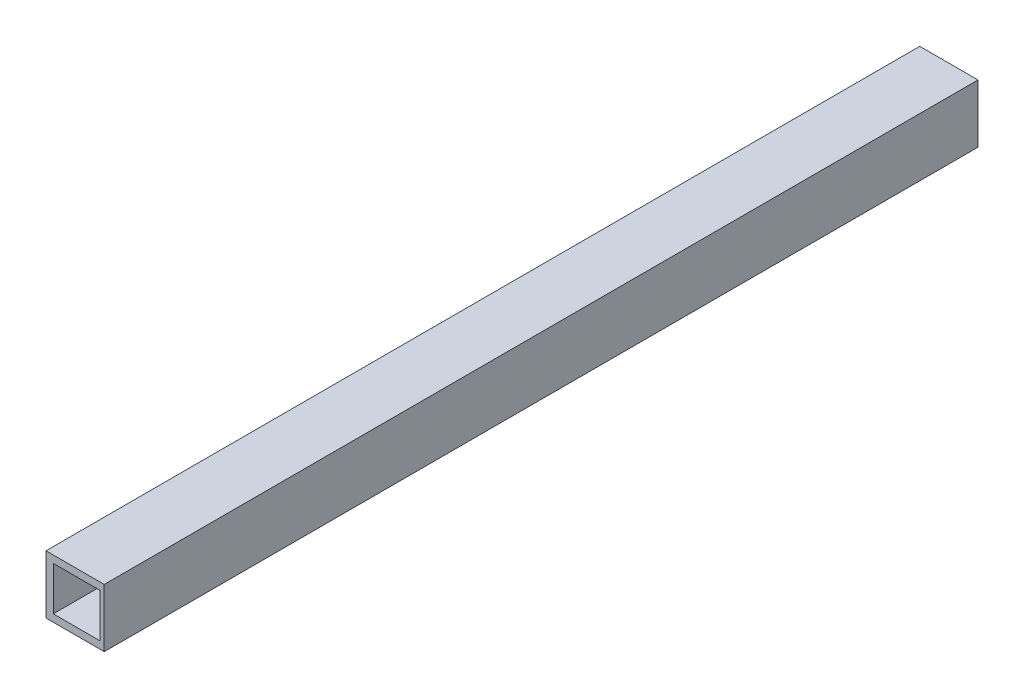
ISO-10303-21;
HEADER;
FILE_DESCRIPTION(('STEP AP214'),'2;1');
FILE_NAME('part.step','',(''),(''),'','','');
FILE_SCHEMA(('AUTOMOTIVE_DESIGN { 1 0 10303 214 1 1 1 1 }'));
ENDSEC;
DATA;
#1=APPLICATION_CONTEXT('core data for automotive mechanical design processes');
#2=APPLICATION_PROTOCOL_DEFINITION('international standard','automotive_design',2000,#1);
#3=PRODUCT_CONTEXT('',#1,'mechanical');
#4=PRODUCT('Part','Part','',(#3));
#5=PRODUCT_RELATED_PRODUCT_CATEGORY('part','',(#4));
#6=PRODUCT_DEFINITION_FORMATION('','',#4);
#7=PRODUCT_DEFINITION_CONTEXT('part definition',#1,'design');
#8=PRODUCT_DEFINITION('design','',#6,#7);
#9=PRODUCT_DEFINITION_SHAPE('','',#8);
#10=(LENGTH_UNIT() NAMED_UNIT(*) SI_UNIT(.MILLI.,.METRE.));
#11=(NAMED_UNIT(*) PLANE_ANGLE_UNIT() SI_UNIT($,.RADIAN.));
#12=(NAMED_UNIT(*) SI_UNIT($,.STERADIAN.) SOLID_ANGLE_UNIT());
#13=UNCERTAINTY_MEASURE_WITH_UNIT(LENGTH_MEASURE(1.E-05),#10,'distance_accuracy_value','');
#14=(GEOMETRIC_REPRESENTATION_CONTEXT(3) GLOBAL_UNCERTAINTY_ASSIGNED_CONTEXT((#13)) GLOBAL_UNIT_ASSIGNED_CONTEXT((#10,
#11,#12)) REPRESENTATION_CONTEXT('',''));
#15=CARTESIAN_POINT('',(0.,0.,0.));
#16=DIRECTION('',(0.,0.,1.));
#17=DIRECTION('',(1.,0.,0.));
#18=AXIS2_PLACEMENT_3D('',#15,#16,#17);
#19=CARTESIAN_POINT('',(0.,0.,381.));
#20=DIRECTION('',(-1.,0.,0.));
#21=DIRECTION('',(0.,-1.,0.));
#22=AXIS2_PLACEMENT_3D('',#19,#20,#21);
#23=PLANE('',#22);
#24=DIRECTION('',(0.,1.,0.));
#25=VECTOR('',#24,1.);
#26=CARTESIAN_POINT('',(0.,0.,0.));
#27=LINE('',#26,#25);
#28=CARTESIAN_POINT('',(0.,0.,0.));
#29=VERTEX_POINT('',#28);
#30=CARTESIAN_POINT('',(0.,25.4,0.));
#31=VERTEX_POINT('',#30);
#32=EDGE_CURVE('E148',#29,#31,#27,.T.);
#33=ORIENTED_EDGE('',*,*,#32,.F.);
#34=DIRECTION('',(0.,0.,-1.));
#35=VECTOR('',#34,1.);
#36=CARTESIAN_POINT('',(0.,0.,381.));
#37=LINE('',#36,#35);
#38=CARTESIAN_POINT('',(0.,0.,381.));
#39=VERTEX_POINT('',#38);
#40=EDGE_CURVE('E11',#39,#29,#37,.T.);
#41=ORIENTED_EDGE('',*,*,#40,.F.);
#42=DIRECTION('',(0.,1.,0.));
#43=VECTOR('',#42,1.);
#44=CARTESIAN_POINT('',(0.,0.,381.));
#45=LINE('',#44,#43);
#46=CARTESIAN_POINT('',(0.,25.4,381.));
#47=VERTEX_POINT('',#46);
#48=EDGE_CURVE('E154',#39,#47,#45,.T.);
#49=ORIENTED_EDGE('',*,*,#48,.T.);
#50=DIRECTION('',(0.,0.,-1.));
#51=VECTOR('',#50,1.);
#52=CARTESIAN_POINT('',(0.,25.4,381.));
#53=LINE('',#52,#51);
#54=EDGE_CURVE('E42',#47,#31,#53,.T.);
#55=ORIENTED_EDGE('',*,*,#54,.T.);
#56=EDGE_LOOP('',(#33,#41,#49,#55));
#57=FACE_BOUND('',#56,.T.);
#58=ADVANCED_FACE('F39',(#57),#23,.T.);
#59=CARTESIAN_POINT('',(0.,0.,381.));
#60=DIRECTION('',(0.,1.,0.));
#61=DIRECTION('',(0.,0.,1.));
#62=AXIS2_PLACEMENT_3D('',#59,#60,#61);
#63=PLANE('',#62);
#64=DIRECTION('',(1.,0.,0.));
#65=VECTOR('',#64,1.);
#66=CARTESIAN_POINT('',(0.,0.,0.));
#67=LINE('',#66,#65);
#68=CARTESIAN_POINT('',(25.4,0.,0.));
#69=VERTEX_POINT('',#68);
#70=EDGE_CURVE('E159',#29,#69,#67,.T.);
#71=ORIENTED_EDGE('',*,*,#70,.T.);
#72=DIRECTION('',(0.,0.,-1.));
#73=VECTOR('',#72,1.);
#74=CARTESIAN_POINT('',(25.4,0.,381.));
#75=LINE('',#74,#73);
#76=CARTESIAN_POINT('',(25.4,0.,381.));
#77=VERTEX_POINT('',#76);
#78=EDGE_CURVE('E48',#77,#69,#75,.T.);
#79=ORIENTED_EDGE('',*,*,#78,.F.);
#80=DIRECTION('',(1.,0.,0.));
#81=VECTOR('',#80,1.);
#82=CARTESIAN_POINT('',(0.,0.,381.));
#83=LINE('',#82,#81);
#84=EDGE_CURVE('E166',#39,#77,#83,.T.);
#85=ORIENTED_EDGE('',*,*,#84,.F.);
#86=ORIENTED_EDGE('',*,*,#40,.T.);
#87=EDGE_LOOP('',(#71,#79,#85,#86));
#88=FACE_BOUND('',#87,.T.);
#89=ADVANCED_FACE('F201',(#88),#63,.F.);
#90=CARTESIAN_POINT('',(25.4,0.,381.));
#91=DIRECTION('',(-1.,0.,0.));
#92=DIRECTION('',(0.,-1.,0.));
#93=AXIS2_PLACEMENT_3D('',#90,#91,#92);
#94=PLANE('',#93);
#95=DIRECTION('',(0.,1.,0.));
#96=VECTOR('',#95,1.);
#97=CARTESIAN_POINT('',(25.4,0.,0.));
#98=LINE('',#97,#96);
#99=CARTESIAN_POINT('',(25.4,25.4,0.));
#100=VERTEX_POINT('',#99);
#101=EDGE_CURVE('E176',#69,#100,#98,.T.);
#102=ORIENTED_EDGE('',*,*,#101,.T.);
#103=DIRECTION('',(0.,0.,-1.));
#104=VECTOR('',#103,1.);
#105=CARTESIAN_POINT('',(25.4,25.4,381.));
#106=LINE('',#105,#104);
#107=CARTESIAN_POINT('',(25.4,25.4,381.));
#108=VERTEX_POINT('',#107);
#109=EDGE_CURVE('E184',#108,#100,#106,.T.);
#110=ORIENTED_EDGE('',*,*,#109,.F.);
#111=DIRECTION('',(0.,1.,0.));
#112=VECTOR('',#111,1.);
#113=CARTESIAN_POINT('',(25.4,0.,381.));
#114=LINE('',#113,#112);
#115=EDGE_CURVE('E163',#77,#108,#114,.T.);
#116=ORIENTED_EDGE('',*,*,#115,.F.);
#117=ORIENTED_EDGE('',*,*,#78,.T.);
#118=EDGE_LOOP('',(#102,#110,#116,#117));
#119=FACE_BOUND('',#118,.T.);
#120=ADVANCED_FACE('F205',(#119),#94,.F.);
#121=CARTESIAN_POINT('',(0.,25.4,381.));
#122=DIRECTION('',(0.,1.,0.));
#123=DIRECTION('',(0.,0.,1.));
#124=AXIS2_PLACEMENT_3D('',#121,#122,#123);
#125=PLANE('',#124);
#126=DIRECTION('',(1.,0.,0.));
#127=VECTOR('',#126,1.);
#128=CARTESIAN_POINT('',(0.,25.4,0.));
#129=LINE('',#128,#127);
#130=EDGE_CURVE('E172',#31,#100,#129,.T.);
#131=ORIENTED_EDGE('',*,*,#130,.F.);
#132=ORIENTED_EDGE('',*,*,#54,.F.);
#133=DIRECTION('',(1.,0.,0.));
#134=VECTOR('',#133,1.);
#135=CARTESIAN_POINT('',(0.,25.4,381.));
#136=LINE('',#135,#134);
#137=EDGE_CURVE('E158',#47,#108,#136,.T.);
#138=ORIENTED_EDGE('',*,*,#137,.T.);
#139=ORIENTED_EDGE('',*,*,#109,.T.);
#140=EDGE_LOOP('',(#131,#132,#138,#139));
#141=FACE_BOUND('',#140,.T.);
#142=ADVANCED_FACE('F194',(#141),#125,.T.);
#143=CARTESIAN_POINT('',(0.,0.,381.));
#144=DIRECTION('',(0.,0.,-1.));
#145=DIRECTION('',(-1.,0.,0.));
#146=AXIS2_PLACEMENT_3D('',#143,#144,#145);
#147=PLANE('',#146);
#148=DIRECTION('',(1.,0.,0.));
#149=VECTOR('',#148,1.);
#150=CARTESIAN_POINT('',(23.4777661909682,22.225,381.));
#151=LINE('',#150,#149);
#152=CARTESIAN_POINT('',(3.175,22.225,381.));
#153=VERTEX_POINT('',#152);
#154=CARTESIAN_POINT('',(23.4777661909682,22.225,381.));
#155=VERTEX_POINT('',#154);
#156=EDGE_CURVE('E114',#153,#155,#151,.T.);
#157=ORIENTED_EDGE('',*,*,#156,.T.);
#158=DIRECTION('',(0.,-1.,0.));
#159=VECTOR('',#158,1.);
#160=CARTESIAN_POINT('',(23.4777661909682,22.225,381.));
#161=LINE('',#160,#159);
#162=CARTESIAN_POINT('',(23.4777661909682,3.175,381.));
#163=VERTEX_POINT('',#162);
#164=EDGE_CURVE('E107',#155,#163,#161,.T.);
#165=ORIENTED_EDGE('',*,*,#164,.T.);
#166=DIRECTION('',(-1.,0.,0.));
#167=VECTOR('',#166,1.);
#168=CARTESIAN_POINT('',(23.4777661909682,3.175,381.));
#169=LINE('',#168,#167);
#170=CARTESIAN_POINT('',(3.175,3.175,381.));
#171=VERTEX_POINT('',#170);
#172=EDGE_CURVE('E117',#163,#171,#169,.T.);
#173=ORIENTED_EDGE('',*,*,#172,.T.);
#174=DIRECTION('',(0.,1.,0.));
#175=VECTOR('',#174,1.);
#176=CARTESIAN_POINT('',(3.175,22.225,381.));
#177=LINE('',#176,#175);
#178=EDGE_CURVE('E56',#171,#153,#177,.T.);
#179=ORIENTED_EDGE('',*,*,#178,.T.);
#180=EDGE_LOOP('',(#157,#165,#173,#179));
#181=FACE_BOUND('',#180,.T.);
#182=ORIENTED_EDGE('',*,*,#48,.F.);
#183=ORIENTED_EDGE('',*,*,#84,.T.);
#184=ORIENTED_EDGE('',*,*,#115,.T.);
#185=ORIENTED_EDGE('',*,*,#137,.F.);
#186=EDGE_LOOP('',(#182,#183,#184,#185));
#187=FACE_BOUND('',#186,.T.);
#188=ADVANCED_FACE('F122',(#181,#187),#147,.F.);
#189=CARTESIAN_POINT('',(0.,0.,0.));
#190=DIRECTION('',(0.,0.,-1.));
#191=DIRECTION('',(-1.,0.,0.));
#192=AXIS2_PLACEMENT_3D('',#189,#190,#191);
#193=PLANE('',#192);
#194=DIRECTION('',(0.,-1.,0.));
#195=VECTOR('',#194,1.);
#196=CARTESIAN_POINT('',(23.4777661909682,22.225,0.));
#197=LINE('',#196,#195);
#198=CARTESIAN_POINT('',(23.4777661909682,22.225,0.));
#199=VERTEX_POINT('',#198);
#200=CARTESIAN_POINT('',(23.4777661909682,3.175,0.));
#201=VERTEX_POINT('',#200);
#202=EDGE_CURVE('E64',#199,#201,#197,.T.);
#203=ORIENTED_EDGE('',*,*,#202,.F.);
#204=DIRECTION('',(1.,0.,0.));
#205=VECTOR('',#204,1.);
#206=CARTESIAN_POINT('',(23.4777661909682,22.225,0.));
#207=LINE('',#206,#205);
#208=CARTESIAN_POINT('',(3.175,22.225,0.));
#209=VERTEX_POINT('',#208);
#210=EDGE_CURVE('E126',#209,#199,#207,.T.);
#211=ORIENTED_EDGE('',*,*,#210,.F.);
#212=DIRECTION('',(0.,1.,0.));
#213=VECTOR('',#212,1.);
#214=CARTESIAN_POINT('',(3.175,22.225,0.));
#215=LINE('',#214,#213);
#216=CARTESIAN_POINT('',(3.175,3.175,0.));
#217=VERTEX_POINT('',#216);
#218=EDGE_CURVE('E130',#217,#209,#215,.T.);
#219=ORIENTED_EDGE('',*,*,#218,.F.);
#220=DIRECTION('',(-1.,0.,0.));
#221=VECTOR('',#220,1.);
#222=CARTESIAN_POINT('',(23.4777661909682,3.175,0.));
#223=LINE('',#222,#221);
#224=EDGE_CURVE('E139',#201,#217,#223,.T.);
#225=ORIENTED_EDGE('',*,*,#224,.F.);
#226=EDGE_LOOP('',(#203,#211,#219,#225));
#227=FACE_BOUND('',#226,.T.);
#228=ORIENTED_EDGE('',*,*,#32,.T.);
#229=ORIENTED_EDGE('',*,*,#130,.T.);
#230=ORIENTED_EDGE('',*,*,#101,.F.);
#231=ORIENTED_EDGE('',*,*,#70,.F.);
#232=EDGE_LOOP('',(#228,#229,#230,#231));
#233=FACE_BOUND('',#232,.T.);
#234=ADVANCED_FACE('F198',(#227,#233),#193,.T.);
#235=CARTESIAN_POINT('',(23.4777661909682,22.225,381.));
#236=DIRECTION('',(1.,0.,0.));
#237=DIRECTION('',(0.,1.,0.));
#238=AXIS2_PLACEMENT_3D('',#235,#236,#237);
#239=PLANE('',#238);
#240=ORIENTED_EDGE('',*,*,#202,.T.);
#241=DIRECTION('',(0.,0.,-1.));
#242=VECTOR('',#241,1.);
#243=CARTESIAN_POINT('',(23.4777661909682,3.175,381.));
#244=LINE('',#243,#242);
#245=EDGE_CURVE('E103',#163,#201,#244,.T.);
#246=ORIENTED_EDGE('',*,*,#245,.F.);
#247=ORIENTED_EDGE('',*,*,#164,.F.);
#248=DIRECTION('',(0.,0.,-1.));
#249=VECTOR('',#248,1.);
#250=CARTESIAN_POINT('',(23.4777661909682,22.225,381.));
#251=LINE('',#250,#249);
#252=EDGE_CURVE('E145',#155,#199,#251,.T.);
#253=ORIENTED_EDGE('',*,*,#252,.T.);
#254=EDGE_LOOP('',(#240,#246,#247,#253));
#255=FACE_BOUND('',#254,.T.);
#256=ADVANCED_FACE('F105',(#255),#239,.F.);
#257=CARTESIAN_POINT('',(23.4777661909682,22.225,381.));
#258=DIRECTION('',(0.,1.,0.));
#259=DIRECTION('',(0.,0.,1.));
#260=AXIS2_PLACEMENT_3D('',#257,#258,#259);
#261=PLANE('',#260);
#262=ORIENTED_EDGE('',*,*,#210,.T.);
#263=ORIENTED_EDGE('',*,*,#252,.F.);
#264=ORIENTED_EDGE('',*,*,#156,.F.);
#265=DIRECTION('',(0.,0.,-1.));
#266=VECTOR('',#265,1.);
#267=CARTESIAN_POINT('',(3.175,22.225,381.));
#268=LINE('',#267,#266);
#269=EDGE_CURVE('E149',#153,#209,#268,.T.);
#270=ORIENTED_EDGE('',*,*,#269,.T.);
#271=EDGE_LOOP('',(#262,#263,#264,#270));
#272=FACE_BOUND('',#271,.T.);
#273=ADVANCED_FACE('F249',(#272),#261,.F.);
#274=CARTESIAN_POINT('',(3.175,22.225,381.));
#275=DIRECTION('',(-1.,0.,0.));
#276=DIRECTION('',(0.,-1.,0.));
#277=AXIS2_PLACEMENT_3D('',#274,#275,#276);
#278=PLANE('',#277);
#279=ORIENTED_EDGE('',*,*,#218,.T.);
#280=ORIENTED_EDGE('',*,*,#269,.F.);
#281=ORIENTED_EDGE('',*,*,#178,.F.);
#282=DIRECTION('',(0.,0.,-1.));
#283=VECTOR('',#282,1.);
#284=CARTESIAN_POINT('',(3.175,3.175,381.));
#285=LINE('',#284,#283);
#286=EDGE_CURVE('E113',#171,#217,#285,.T.);
#287=ORIENTED_EDGE('',*,*,#286,.T.);
#288=EDGE_LOOP('',(#279,#280,#281,#287));
#289=FACE_BOUND('',#288,.T.);
#290=ADVANCED_FACE('F257',(#289),#278,.F.);
#291=CARTESIAN_POINT('',(23.4777661909682,3.175,381.));
#292=DIRECTION('',(0.,-1.,0.));
#293=DIRECTION('',(0.,0.,-1.));
#294=AXIS2_PLACEMENT_3D('',#291,#292,#293);
#295=PLANE('',#294);
#296=ORIENTED_EDGE('',*,*,#224,.T.);
#297=ORIENTED_EDGE('',*,*,#286,.F.);
#298=ORIENTED_EDGE('',*,*,#172,.F.);
#299=ORIENTED_EDGE('',*,*,#245,.T.);
#300=EDGE_LOOP('',(#296,#297,#298,#299));
#301=FACE_BOUND('',#300,.T.);
#302=ADVANCED_FACE('F118',(#301),#295,.F.);
#303=CLOSED_SHELL('',(#58,#89,#120,#142,#188,#234,#256,#273,#290,#302));
#304=MANIFOLD_SOLID_BREP('B2',#303);
#305=ADVANCED_BREP_SHAPE_REPRESENTATION('',(#18,#304),#14);
#306=SHAPE_DEFINITION_REPRESENTATION(#9,#305);
ENDSEC;
END-ISO-10303-21;
